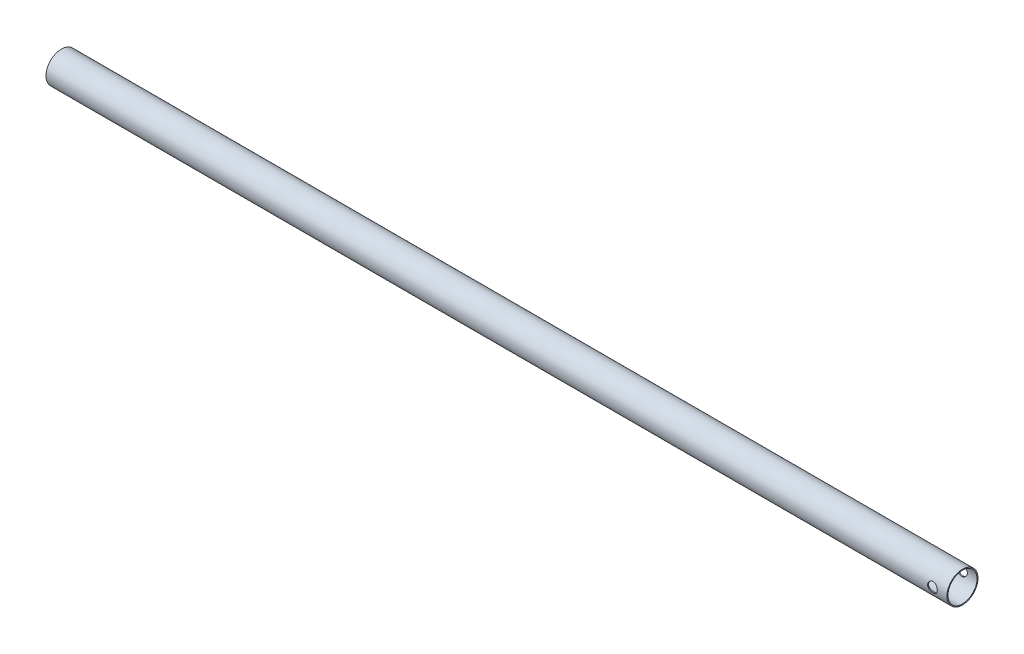
ISO-10303-21;
HEADER;
FILE_DESCRIPTION(('STEP AP214'),'2;1');
FILE_NAME('part.step','',(''),(''),'','','');
FILE_SCHEMA(('AUTOMOTIVE_DESIGN { 1 0 10303 214 1 1 1 1 }'));
ENDSEC;
DATA;
#1=APPLICATION_CONTEXT('core data for automotive mechanical design processes');
#2=APPLICATION_PROTOCOL_DEFINITION('international standard','automotive_design',2000,#1);
#3=PRODUCT_CONTEXT('',#1,'mechanical');
#4=PRODUCT('Part','Part','',(#3));
#5=PRODUCT_RELATED_PRODUCT_CATEGORY('part','',(#4));
#6=PRODUCT_DEFINITION_FORMATION('','',#4);
#7=PRODUCT_DEFINITION_CONTEXT('part definition',#1,'design');
#8=PRODUCT_DEFINITION('design','',#6,#7);
#9=PRODUCT_DEFINITION_SHAPE('','',#8);
#10=(LENGTH_UNIT() NAMED_UNIT(*) SI_UNIT(.MILLI.,.METRE.));
#11=(NAMED_UNIT(*) PLANE_ANGLE_UNIT() SI_UNIT($,.RADIAN.));
#12=(NAMED_UNIT(*) SI_UNIT($,.STERADIAN.) SOLID_ANGLE_UNIT());
#13=UNCERTAINTY_MEASURE_WITH_UNIT(LENGTH_MEASURE(1.E-05),#10,'distance_accuracy_value','');
#14=(GEOMETRIC_REPRESENTATION_CONTEXT(3) GLOBAL_UNCERTAINTY_ASSIGNED_CONTEXT((#13)) GLOBAL_UNIT_ASSIGNED_CONTEXT((#10,
#11,#12)) REPRESENTATION_CONTEXT('',''));
#15=CARTESIAN_POINT('',(0.,0.,0.));
#16=DIRECTION('',(0.,0.,1.));
#17=DIRECTION('',(1.,0.,0.));
#18=AXIS2_PLACEMENT_3D('',#15,#16,#17);
#19=CARTESIAN_POINT('',(-929.,0.,0.));
#20=DIRECTION('',(1.,0.,0.));
#21=DIRECTION('',(0.,0.,-1.));
#22=AXIS2_PLACEMENT_3D('',#19,#20,#21);
#23=CYLINDRICAL_SURFACE('',#22,16.);
#24=CARTESIAN_POINT('',(-20.,0.,-16.));
#25=CARTESIAN_POINT('',(-19.9999982136497,0.273756740698178,-15.9999986351195));
#26=CARTESIAN_POINT('',(-19.9774430922222,0.547532210011409,-15.9929077993933));
#27=CARTESIAN_POINT('',(-19.888055033843,1.08707683835382,-15.9653157635526));
#28=CARTESIAN_POINT('',(-19.8212120745424,1.35284417090373,-15.9448115279957));
#29=CARTESIAN_POINT('',(-19.6457225152172,1.86851417460313,-15.892632627915));
#30=CARTESIAN_POINT('',(-19.5371406213887,2.11844070794284,-15.860975259956));
#31=CARTESIAN_POINT('',(-19.2815307292862,2.59653920938622,-15.7897587664487));
#32=CARTESIAN_POINT('',(-19.1344966728757,2.82470774178094,-15.7501983960149));
#33=CARTESIAN_POINT('',(-18.8013760319326,3.25986133980768,-15.6660085495921));
#34=CARTESIAN_POINT('',(-18.6143164597633,3.46608011262119,-15.621268637007));
#35=CARTESIAN_POINT('',(-18.2085264303382,3.84478952815342,-15.5324018550409));
#36=CARTESIAN_POINT('',(-17.9897900899934,4.01727389161514,-15.4882751012093));
#37=CARTESIAN_POINT('',(-17.5202217447927,4.32777345930637,-15.4044457876484));
#38=CARTESIAN_POINT('',(-17.2687300899923,4.4648313659311,-15.3648795310221));
#39=CARTESIAN_POINT('',(-16.7448307401774,4.69438964299238,-15.2963120709366));
#40=CARTESIAN_POINT('',(-16.4724285768566,4.78690175085853,-15.2673080849026));
#41=CARTESIAN_POINT('',(-15.9230876901663,4.92193839721856,-15.224304279618));
#42=CARTESIAN_POINT('',(-15.6465326254318,4.96588440031618,-15.2098789171452));
#43=CARTESIAN_POINT('',(-15.0896275243652,5.00698220147793,-15.1964022056731));
#44=CARTESIAN_POINT('',(-14.809278516739,5.00414643984172,-15.1973467694717));
#45=CARTESIAN_POINT('',(-14.2645021588889,4.95287298929817,-15.2141275626545));
#46=CARTESIAN_POINT('',(-13.9998834964481,4.90624231472934,-15.2293736684469));
#47=CARTESIAN_POINT('',(-13.482431373751,4.7716325341796,-15.272081024701));
#48=CARTESIAN_POINT('',(-13.2295991691417,4.68364903377187,-15.2995435733467));
#49=CARTESIAN_POINT('',(-12.7385922223016,4.46755498726522,-15.3640417609541));
#50=CARTESIAN_POINT('',(-12.5006855572407,4.33887702648706,-15.4012113865356));
#51=CARTESIAN_POINT('',(-12.0492489284749,4.04544082951013,-15.4808742631002));
#52=CARTESIAN_POINT('',(-11.8357253189828,3.88067322086205,-15.523368895754));
#53=CARTESIAN_POINT('',(-11.4289002263345,3.51086781672958,-15.6112611120491));
#54=CARTESIAN_POINT('',(-11.2369617688819,3.30433828237156,-15.6567027842357));
#55=CARTESIAN_POINT('',(-10.8901124256806,2.86145763238183,-15.7436628303753));
#56=CARTESIAN_POINT('',(-10.735204283123,2.625104309396,-15.7851809135328));
#57=CARTESIAN_POINT('',(-10.4658892455951,2.12665844186189,-15.8600517956098));
#58=CARTESIAN_POINT('',(-10.3518074581442,1.86437962767713,-15.8933384259289));
#59=CARTESIAN_POINT('',(-10.1697879965937,1.32307191113055,-15.9475182331416));
#60=CARTESIAN_POINT('',(-10.1018363110464,1.04404812289842,-15.9684151730059));
#61=CARTESIAN_POINT('',(-10.0163278296841,0.488740629161379,-15.9948555758007));
#62=CARTESIAN_POINT('',(-9.9969258256259,0.212767395155368,-16.0009609158175));
#63=CARTESIAN_POINT('',(-10.0038649065493,-0.338521222930351,-15.9987919892393));
#64=CARTESIAN_POINT('',(-10.0301993092904,-0.613836697226041,-15.9905198232454));
#65=CARTESIAN_POINT('',(-10.1263823704255,-1.1488773319034,-15.9608945507905));
#66=CARTESIAN_POINT('',(-10.1951330704499,-1.40881991368375,-15.9398717244275));
#67=CARTESIAN_POINT('',(-10.3728574094669,-1.91340771544551,-15.8872048551716));
#68=CARTESIAN_POINT('',(-10.4818360161,-2.15805104179624,-15.8555595005737));
#69=CARTESIAN_POINT('',(-10.7398928661947,-2.63172962668876,-15.783941710377));
#70=CARTESIAN_POINT('',(-10.8898839499872,-2.86023895915117,-15.7437850727067));
#71=CARTESIAN_POINT('',(-11.2246128404697,-3.28946340384104,-15.6597364001372));
#72=CARTESIAN_POINT('',(-11.4093600709786,-3.4901709521758,-15.6158433539155));
#73=CARTESIAN_POINT('',(-11.8170355602084,-3.86634985167608,-15.5270797953257));
#74=CARTESIAN_POINT('',(-12.0411866549569,-4.04050609358125,-15.4822394682577));
#75=CARTESIAN_POINT('',(-12.5165064655071,-4.34885000980606,-15.3984778838242));
#76=CARTESIAN_POINT('',(-12.7676747521079,-4.48303831893719,-15.3595565324524));
#77=CARTESIAN_POINT('',(-13.2893806914819,-4.70680333922169,-15.2924712932348));
#78=CARTESIAN_POINT('',(-13.5598385977429,-4.7965527822405,-15.264265854275));
#79=CARTESIAN_POINT('',(-14.1130899729945,-4.92891577272361,-15.2220468337724));
#80=CARTESIAN_POINT('',(-14.3958787053741,-4.97154725655978,-15.2080278520491));
#81=CARTESIAN_POINT('',(-14.9520163503217,-5.00717624632503,-15.1963317085551));
#82=CARTESIAN_POINT('',(-15.2252138153897,-5.00233118486543,-15.1979441840057));
#83=CARTESIAN_POINT('',(-15.7666983397678,-4.94835272515335,-15.2156036150361));
#84=CARTESIAN_POINT('',(-16.0349856275469,-4.89922139290049,-15.2316498972642));
#85=CARTESIAN_POINT('',(-16.5551761583676,-4.7595091965447,-15.2758725673356));
#86=CARTESIAN_POINT('',(-16.8072617643734,-4.66954569624033,-15.3038679276103));
#87=CARTESIAN_POINT('',(-17.292961654136,-4.45120909339998,-15.3687881701826));
#88=CARTESIAN_POINT('',(-17.5265721683136,-4.32282817776947,-15.4057148685869));
#89=CARTESIAN_POINT('',(-17.9785838817593,-4.02542700053973,-15.4861394813401));
#90=CARTESIAN_POINT('',(-18.196032518001,-3.85501334096529,-15.5298379569183));
#91=CARTESIAN_POINT('',(-18.599945312448,-3.48083598561919,-15.6179599528484));
#92=CARTESIAN_POINT('',(-18.7864011559642,-3.27706336937756,-15.6623836642662));
#93=CARTESIAN_POINT('',(-19.1291301534517,-2.83394665129338,-15.7486908780989));
#94=CARTESIAN_POINT('',(-19.2842189457998,-2.59365829794954,-15.7904440692269));
#95=CARTESIAN_POINT('',(-19.5515956605578,-2.0891165520546,-15.8650707718751));
#96=CARTESIAN_POINT('',(-19.6639004085673,-1.82487263118179,-15.8979477726329));
#97=CARTESIAN_POINT('',(-19.8343654704339,-1.30299054149591,-15.9488260293388));
#98=CARTESIAN_POINT('',(-19.8962994692213,-1.04668134845019,-15.9678496322456));
#99=CARTESIAN_POINT('',(-19.9791134398709,-0.526919581760988,-15.9934360136194));
#100=CARTESIAN_POINT('',(-20.000001719216,-0.263468464558692,-16.0000013135858));
#101=CARTESIAN_POINT('',(-20.,0.,-16.));
#102=B_SPLINE_CURVE_WITH_KNOTS('',3,(#24,#25,#26,#27,#28,#29,#30,#31,#32,#33,#34,#35,#36,#37,
#38,#39,#40,#41,#42,#43,#44,#45,#46,#47,#48,#49,#50,#51,#52,#53,#54,#55,#56,#57,#58,#59,#60,#61,
#62,#63,#64,#65,#66,#67,#68,#69,#70,#71,#72,#73,#74,#75,#76,#77,#78,#79,#80,#81,#82,#83,#84,#85,
#86,#87,#88,#89,#90,#91,#92,#93,#94,#95,#96,#97,#98,#99,#100,#101),.UNSPECIFIED.,.T.,.F.,(4,2,2,
2,2,2,2,2,2,2,2,2,2,2,2,2,2,2,2,2,2,2,2,2,2,2,2,2,2,2,2,2,2,2,2,2,2,2,4),(0.,0.820301797730039,
1.64078929339627,2.46000991680975,3.27935968623357,4.12151288780634,4.96382269725105,
5.82695084991453,6.68985145121464,7.52676600672195,8.36345801183909,9.16707669695194,
9.97078079925601,10.7862257089153,11.6018826405078,12.4546698912775,13.3075202966256,
14.1670184276843,15.0262553798757,15.852302742023,16.678229426068,17.4836250690084,
18.2891202014735,19.1142529896272,19.9396098284639,20.7976711486191,21.655718839442,
22.5104046302277,23.3647649559871,24.1804881394266,24.9961732705188,25.7999165363423,
26.6038233736824,27.4391805607299,28.274761495409,29.1376267255319,30.0001522671289,
30.789785466537,31.5792588309973),.UNSPECIFIED.);
#103=CARTESIAN_POINT('',(-20.,0.,-16.));
#104=VERTEX_POINT('',#103);
#105=EDGE_CURVE('E84',#104,#104,#102,.T.);
#106=ORIENTED_EDGE('',*,*,#105,.F.);
#107=EDGE_LOOP('',(#106));
#108=FACE_BOUND('',#107,.T.);
#109=CARTESIAN_POINT('',(-10.,0.,16.));
#110=CARTESIAN_POINT('',(-10.0000017863503,0.273756740698177,15.9999986351195));
#111=CARTESIAN_POINT('',(-10.0225569077778,0.547532210011408,15.9929077993933));
#112=CARTESIAN_POINT('',(-10.111944966157,1.08707683835382,15.9653157635526));
#113=CARTESIAN_POINT('',(-10.1787879254576,1.35284417090373,15.9448115279957));
#114=CARTESIAN_POINT('',(-10.3542774847828,1.86851417460312,15.892632627915));
#115=CARTESIAN_POINT('',(-10.4628593786113,2.11844070794284,15.860975259956));
#116=CARTESIAN_POINT('',(-10.7184692707138,2.59653920938621,15.7897587664487));
#117=CARTESIAN_POINT('',(-10.8655033271243,2.82470774178094,15.7501983960149));
#118=CARTESIAN_POINT('',(-11.1986239680674,3.25986133980768,15.6660085495921));
#119=CARTESIAN_POINT('',(-11.3856835402367,3.46608011262119,15.621268637007));
#120=CARTESIAN_POINT('',(-11.7914735696618,3.84478952815342,15.5324018550409));
#121=CARTESIAN_POINT('',(-12.0102099100066,4.01727389161514,15.4882751012093));
#122=CARTESIAN_POINT('',(-12.4797782552073,4.32777345930637,15.4044457876484));
#123=CARTESIAN_POINT('',(-12.7312699100077,4.4648313659311,15.3648795310221));
#124=CARTESIAN_POINT('',(-13.2551692598226,4.69438964299238,15.2963120709366));
#125=CARTESIAN_POINT('',(-13.5275714231434,4.78690175085853,15.2673080849026));
#126=CARTESIAN_POINT('',(-14.0769123098337,4.92193839721856,15.224304279618));
#127=CARTESIAN_POINT('',(-14.3534673745682,4.96588440031618,15.2098789171452));
#128=CARTESIAN_POINT('',(-14.9103724756348,5.00698220147793,15.1964022056731));
#129=CARTESIAN_POINT('',(-15.190721483261,5.00414643984172,15.1973467694717));
#130=CARTESIAN_POINT('',(-15.7354978411111,4.95287298929817,15.2141275626545));
#131=CARTESIAN_POINT('',(-16.0001165035519,4.90624231472934,15.2293736684469));
#132=CARTESIAN_POINT('',(-16.517568626249,4.77163253417961,15.272081024701));
#133=CARTESIAN_POINT('',(-16.7704008308583,4.68364903377187,15.2995435733467));
#134=CARTESIAN_POINT('',(-17.2614077776984,4.46755498726522,15.3640417609541));
#135=CARTESIAN_POINT('',(-17.4993144427593,4.33887702648706,15.4012113865356));
#136=CARTESIAN_POINT('',(-17.9507510715251,4.04544082951013,15.4808742631002));
#137=CARTESIAN_POINT('',(-18.1642746810172,3.88067322086205,15.523368895754));
#138=CARTESIAN_POINT('',(-18.5710997736655,3.51086781672958,15.6112611120491));
#139=CARTESIAN_POINT('',(-18.7630382311181,3.30433828237156,15.6567027842357));
#140=CARTESIAN_POINT('',(-19.1098875743194,2.86145763238183,15.7436628303753));
#141=CARTESIAN_POINT('',(-19.264795716877,2.625104309396,15.7851809135328));
#142=CARTESIAN_POINT('',(-19.5341107544049,2.12665844186189,15.8600517956098));
#143=CARTESIAN_POINT('',(-19.6481925418558,1.86437962767714,15.8933384259289));
#144=CARTESIAN_POINT('',(-19.8302120034063,1.32307191113055,15.9475182331416));
#145=CARTESIAN_POINT('',(-19.8981636889536,1.04404812289843,15.9684151730059));
#146=CARTESIAN_POINT('',(-19.9836721703159,0.488740629161383,15.9948555758007));
#147=CARTESIAN_POINT('',(-20.0030741743741,0.212767395155371,16.0009609158175));
#148=CARTESIAN_POINT('',(-19.9961350934507,-0.338521222930347,15.9987919892393));
#149=CARTESIAN_POINT('',(-19.9698006907096,-0.613836697226038,15.9905198232454));
#150=CARTESIAN_POINT('',(-19.8736176295745,-1.1488773319034,15.9608945507905));
#151=CARTESIAN_POINT('',(-19.8048669295501,-1.40881991368375,15.9398717244275));
#152=CARTESIAN_POINT('',(-19.6271425905331,-1.91340771544551,15.8872048551716));
#153=CARTESIAN_POINT('',(-19.5181639839,-2.15805104179623,15.8555595005737));
#154=CARTESIAN_POINT('',(-19.2601071338053,-2.63172962668875,15.783941710377));
#155=CARTESIAN_POINT('',(-19.1101160500128,-2.86023895915116,15.7437850727067));
#156=CARTESIAN_POINT('',(-18.7753871595303,-3.28946340384104,15.6597364001372));
#157=CARTESIAN_POINT('',(-18.5906399290214,-3.4901709521758,15.6158433539155));
#158=CARTESIAN_POINT('',(-18.1829644397916,-3.86634985167608,15.5270797953257));
#159=CARTESIAN_POINT('',(-17.9588133450431,-4.04050609358125,15.4822394682577));
#160=CARTESIAN_POINT('',(-17.4834935344929,-4.34885000980606,15.3984778838242));
#161=CARTESIAN_POINT('',(-17.2323252478921,-4.48303831893719,15.3595565324524));
#162=CARTESIAN_POINT('',(-16.7106193085181,-4.70680333922169,15.2924712932348));
#163=CARTESIAN_POINT('',(-16.4401614022571,-4.7965527822405,15.264265854275));
#164=CARTESIAN_POINT('',(-15.8869100270055,-4.92891577272361,15.2220468337724));
#165=CARTESIAN_POINT('',(-15.6041212946259,-4.97154725655978,15.2080278520491));
#166=CARTESIAN_POINT('',(-15.0479836496783,-5.00717624632503,15.1963317085551));
#167=CARTESIAN_POINT('',(-14.7747861846103,-5.00233118486543,15.1979441840057));
#168=CARTESIAN_POINT('',(-14.2333016602322,-4.94835272515335,15.2156036150361));
#169=CARTESIAN_POINT('',(-13.9650143724531,-4.89922139290049,15.2316498972642));
#170=CARTESIAN_POINT('',(-13.4448238416324,-4.7595091965447,15.2758725673356));
#171=CARTESIAN_POINT('',(-13.1927382356266,-4.66954569624033,15.3038679276103));
#172=CARTESIAN_POINT('',(-12.707038345864,-4.45120909339998,15.3687881701826));
#173=CARTESIAN_POINT('',(-12.4734278316864,-4.32282817776948,15.4057148685869));
#174=CARTESIAN_POINT('',(-12.0214161182407,-4.02542700053973,15.4861394813401));
#175=CARTESIAN_POINT('',(-11.803967481999,-3.85501334096529,15.5298379569183));
#176=CARTESIAN_POINT('',(-11.400054687552,-3.4808359856192,15.6179599528484));
#177=CARTESIAN_POINT('',(-11.2135988440358,-3.27706336937756,15.6623836642662));
#178=CARTESIAN_POINT('',(-10.8708698465483,-2.83394665129339,15.7486908780989));
#179=CARTESIAN_POINT('',(-10.7157810542002,-2.59365829794954,15.7904440692269));
#180=CARTESIAN_POINT('',(-10.4484043394422,-2.0891165520546,15.8650707718751));
#181=CARTESIAN_POINT('',(-10.3360995914327,-1.8248726311818,15.8979477726329));
#182=CARTESIAN_POINT('',(-10.1656345295661,-1.30299054149592,15.9488260293388));
#183=CARTESIAN_POINT('',(-10.1037005307786,-1.04668134845019,15.9678496322456));
#184=CARTESIAN_POINT('',(-10.0208865601291,-0.526919581760991,15.9934360136194));
#185=CARTESIAN_POINT('',(-9.999998280784,-0.263468464558694,16.0000013135858));
#186=CARTESIAN_POINT('',(-10.,0.,16.));
#187=B_SPLINE_CURVE_WITH_KNOTS('',3,(#109,#110,#111,#112,#113,#114,#115,#116,#117,#118,#119,
#120,#121,#122,#123,#124,#125,#126,#127,#128,#129,#130,#131,#132,#133,#134,#135,#136,#137,#138,
#139,#140,#141,#142,#143,#144,#145,#146,#147,#148,#149,#150,#151,#152,#153,#154,#155,#156,#157,
#158,#159,#160,#161,#162,#163,#164,#165,#166,#167,#168,#169,#170,#171,#172,#173,#174,#175,#176,
#177,#178,#179,#180,#181,#182,#183,#184,#185,#186),.UNSPECIFIED.,.T.,.F.,(4,2,2,2,2,2,2,2,2,2,2,
2,2,2,2,2,2,2,2,2,2,2,2,2,2,2,2,2,2,2,2,2,2,2,2,2,2,2,4),(0.,0.82030179773004,1.64078929339627,
2.46000991680975,3.27935968623356,4.12151288780633,4.96382269725105,5.82695084991453,
6.68985145121464,7.52676600672195,8.36345801183909,9.16707669695194,9.97078079925601,
10.7862257089153,11.6018826405078,12.4546698912775,13.3075202966256,14.1670184276843,
15.0262553798757,15.852302742023,16.678229426068,17.4836250690084,18.2891202014735,
19.1142529896272,19.9396098284639,20.7976711486191,21.655718839442,22.5104046302277,
23.3647649559871,24.1804881394266,24.9961732705188,25.7999165363422,26.6038233736824,
27.4391805607299,28.274761495409,29.1376267255319,30.0001522671289,30.789785466537,
31.5792588309973),.UNSPECIFIED.);
#188=CARTESIAN_POINT('',(-10.,0.,16.));
#189=VERTEX_POINT('',#188);
#190=EDGE_CURVE('E80',#189,#189,#187,.T.);
#191=ORIENTED_EDGE('',*,*,#190,.F.);
#192=EDGE_LOOP('',(#191));
#193=FACE_BOUND('',#192,.T.);
#194=CARTESIAN_POINT('',(-929.,0.,0.));
#195=DIRECTION('',(1.,0.,0.));
#196=DIRECTION('',(0.,0.,-1.));
#197=AXIS2_PLACEMENT_3D('',#194,#195,#196);
#198=CIRCLE('',#197,16.);
#199=CARTESIAN_POINT('',(-929.,0.,-16.));
#200=VERTEX_POINT('',#199);
#201=EDGE_CURVE('E11',#200,#200,#198,.T.);
#202=ORIENTED_EDGE('',*,*,#201,.T.);
#203=EDGE_LOOP('',(#202));
#204=FACE_BOUND('',#203,.T.);
#205=CARTESIAN_POINT('',(0.,0.,0.));
#206=DIRECTION('',(1.,0.,0.));
#207=DIRECTION('',(0.,0.,-1.));
#208=AXIS2_PLACEMENT_3D('',#205,#206,#207);
#209=CIRCLE('',#208,16.);
#210=CARTESIAN_POINT('',(0.,0.,-16.));
#211=VERTEX_POINT('',#210);
#212=EDGE_CURVE('E53',#211,#211,#209,.T.);
#213=ORIENTED_EDGE('',*,*,#212,.F.);
#214=EDGE_LOOP('',(#213));
#215=FACE_BOUND('',#214,.T.);
#216=ADVANCED_FACE('F41',(#108,#193,#204,#215),#23,.T.);
#217=CARTESIAN_POINT('',(-929.,0.,0.));
#218=DIRECTION('',(1.,0.,0.));
#219=DIRECTION('',(0.,0.,-1.));
#220=AXIS2_PLACEMENT_3D('',#217,#218,#219);
#221=PLANE('',#220);
#222=CARTESIAN_POINT('',(-929.,0.,0.));
#223=DIRECTION('',(1.,0.,0.));
#224=DIRECTION('',(0.,0.,-1.));
#225=AXIS2_PLACEMENT_3D('',#222,#223,#224);
#226=CIRCLE('',#225,15.);
#227=CARTESIAN_POINT('',(-929.,0.,-15.));
#228=VERTEX_POINT('',#227);
#229=EDGE_CURVE('E58',#228,#228,#226,.T.);
#230=ORIENTED_EDGE('',*,*,#229,.T.);
#231=EDGE_LOOP('',(#230));
#232=FACE_BOUND('',#231,.T.);
#233=ORIENTED_EDGE('',*,*,#201,.F.);
#234=EDGE_LOOP('',(#233));
#235=FACE_BOUND('',#234,.T.);
#236=ADVANCED_FACE('F98',(#232,#235),#221,.F.);
#237=CARTESIAN_POINT('',(0.,0.,0.));
#238=DIRECTION('',(1.,0.,0.));
#239=DIRECTION('',(0.,0.,-1.));
#240=AXIS2_PLACEMENT_3D('',#237,#238,#239);
#241=PLANE('',#240);
#242=CARTESIAN_POINT('',(0.,0.,0.));
#243=DIRECTION('',(1.,0.,0.));
#244=DIRECTION('',(0.,0.,-1.));
#245=AXIS2_PLACEMENT_3D('',#242,#243,#244);
#246=CIRCLE('',#245,15.);
#247=CARTESIAN_POINT('',(0.,0.,-15.));
#248=VERTEX_POINT('',#247);
#249=EDGE_CURVE('E61',#248,#248,#246,.T.);
#250=ORIENTED_EDGE('',*,*,#249,.F.);
#251=EDGE_LOOP('',(#250));
#252=FACE_BOUND('',#251,.T.);
#253=ORIENTED_EDGE('',*,*,#212,.T.);
#254=EDGE_LOOP('',(#253));
#255=FACE_BOUND('',#254,.T.);
#256=ADVANCED_FACE('F95',(#252,#255),#241,.T.);
#257=CARTESIAN_POINT('',(-929.,0.,0.));
#258=DIRECTION('',(1.,0.,0.));
#259=DIRECTION('',(0.,0.,-1.));
#260=AXIS2_PLACEMENT_3D('',#257,#258,#259);
#261=CYLINDRICAL_SURFACE('',#260,15.);
#262=CARTESIAN_POINT('',(-20.,0.,-15.));
#263=CARTESIAN_POINT('',(-20.0000012686582,0.272816814433608,-15.0000007650471));
#264=CARTESIAN_POINT('',(-19.977598669364,0.545625972692718,-14.9924884753769));
#265=CARTESIAN_POINT('',(-19.8888544559139,1.08320880436489,-14.9632605101644));
#266=CARTESIAN_POINT('',(-19.8225082802552,1.3479816405942,-14.941543360109));
#267=CARTESIAN_POINT('',(-19.6484037830799,1.86166394750877,-14.8862653953208));
#268=CARTESIAN_POINT('',(-19.5407146877042,2.11059912942976,-14.8527243865377));
#269=CARTESIAN_POINT('',(-19.2872941358077,2.58687468402704,-14.7772222858721));
#270=CARTESIAN_POINT('',(-19.1415551749849,2.81421078479507,-14.7352595334076));
#271=CARTESIAN_POINT('',(-18.8108709757084,3.24870837510974,-14.6457047221309));
#272=CARTESIAN_POINT('',(-18.6248438287057,3.45501850148552,-14.5979778231161));
#273=CARTESIAN_POINT('',(-18.221164226459,3.83416346351645,-14.5030157392292));
#274=CARTESIAN_POINT('',(-18.0035048253269,4.00699092746984,-14.4557806648007));
#275=CARTESIAN_POINT('',(-17.5350744240448,4.31912471111899,-14.3656666235818));
#276=CARTESIAN_POINT('',(-17.2835313014492,4.45732429102251,-14.3229519627198));
#277=CARTESIAN_POINT('',(-16.7591195278211,4.68909436930558,-14.2487652698844));
#278=CARTESIAN_POINT('',(-16.4862574142214,4.78267848691248,-14.2172898077928));
#279=CARTESIAN_POINT('',(-15.9366338924888,4.91936730756488,-14.1705651637056));
#280=CARTESIAN_POINT('',(-15.6603139575402,4.96406724136036,-14.1548047884338));
#281=CARTESIAN_POINT('',(-15.103681229235,5.00670561667087,-14.1397828315221));
#282=CARTESIAN_POINT('',(-14.8233696964841,5.00465850803658,-14.1405161515599));
#283=CARTESIAN_POINT('',(-14.2803168477388,4.95509951850356,-14.1579507500054));
#284=CARTESIAN_POINT('',(-14.0173579852814,4.90966956578088,-14.1739207918415));
#285=CARTESIAN_POINT('',(-13.5030329018494,4.77803081419367,-14.2188328846856));
#286=CARTESIAN_POINT('',(-13.2516680727977,4.69181713294739,-14.2477764887883));
#287=CARTESIAN_POINT('',(-12.7629362520803,4.47969529031768,-14.3158955569848));
#288=CARTESIAN_POINT('',(-12.5258598726625,4.35317024354077,-14.3552282897692));
#289=CARTESIAN_POINT('',(-12.0756454585912,4.06444553151123,-14.4396279286729));
#290=CARTESIAN_POINT('',(-11.8625143653303,3.9022355618188,-14.4846964894921));
#291=CARTESIAN_POINT('',(-11.4545420091991,3.53674666341247,-14.5783664584198));
#292=CARTESIAN_POINT('',(-11.2612365274554,3.3317657503819,-14.6270294677509));
#293=CARTESIAN_POINT('',(-10.9113436666822,2.89169784984997,-14.7203469193431));
#294=CARTESIAN_POINT('',(-10.7547598091773,2.65660797830397,-14.765000976901));
#295=CARTESIAN_POINT('',(-10.4815184988249,2.15973806523143,-14.8458553968921));
#296=CARTESIAN_POINT('',(-10.3652725432964,1.8977163820817,-14.8819675004026));
#297=CARTESIAN_POINT('',(-10.1789841302214,1.35634541682251,-14.9410283572211));
#298=CARTESIAN_POINT('',(-10.1089256228828,1.07700219077475,-14.9639816827438));
#299=CARTESIAN_POINT('',(-10.0197216698882,0.521919147646519,-14.9933813535722));
#300=CARTESIAN_POINT('',(-9.99850095413625,0.246547999324225,-15.0005000916864));
#301=CARTESIAN_POINT('',(-10.0016633679923,-0.303875349801196,-14.9994451347413));
#302=CARTESIAN_POINT('',(-10.0260387998994,-0.57892759659826,-14.9912740209681));
#303=CARTESIAN_POINT('',(-10.1180595386798,-1.11259933152128,-14.9610012358552));
#304=CARTESIAN_POINT('',(-10.1844310302475,-1.37146403417422,-14.9393099355596));
#305=CARTESIAN_POINT('',(-10.3569672223336,-1.87427979289787,-14.8845923415035));
#306=CARTESIAN_POINT('',(-10.4631369973389,-2.11822894254304,-14.8515646023338));
#307=CARTESIAN_POINT('',(-10.7153521592039,-2.59144148196637,-14.7764465643645));
#308=CARTESIAN_POINT('',(-10.8623729664159,-2.82014979608574,-14.7341407377893));
#309=CARTESIAN_POINT('',(-11.1909707500674,-3.25032415067794,-14.6452626958131));
#310=CARTESIAN_POINT('',(-11.3725582801588,-3.45178183897789,-14.5986891796914));
#311=CARTESIAN_POINT('',(-11.7748937550329,-3.8312625390315,-14.5038423990222));
#312=CARTESIAN_POINT('',(-11.9970461346343,-4.00780484622886,-14.4555880543714));
#313=CARTESIAN_POINT('',(-12.4688578390544,-4.32128761161788,-14.3649986647354));
#314=CARTESIAN_POINT('',(-12.7185173931704,-4.45822773965507,-14.3226636691001));
#315=CARTESIAN_POINT('',(-13.2383650764495,-4.68798465208181,-14.2491195895692));
#316=CARTESIAN_POINT('',(-13.5085103958438,-4.78089066082511,-14.2178880396489));
#317=CARTESIAN_POINT('',(-14.0618932502207,-4.91947333379678,-14.1705416153225));
#318=CARTESIAN_POINT('',(-14.3451248270218,-4.9651712747697,-14.154419931182));
#319=CARTESIAN_POINT('',(-14.9009854802046,-5.00638141238671,-14.1398929437089));
#320=CARTESIAN_POINT('',(-15.1734117014341,-5.004351286542,-14.1406200128708));
#321=CARTESIAN_POINT('',(-15.7138253746103,-4.95621146724347,-14.1575634911934));
#322=CARTESIAN_POINT('',(-15.9818130897754,-4.91010439729293,-14.1737789784681));
#323=CARTESIAN_POINT('',(-16.5006783150124,-4.77685906564673,-14.2192262152446));
#324=CARTESIAN_POINT('',(-16.7517841250225,-4.69051673007757,-14.2482049011239));
#325=CARTESIAN_POINT('',(-17.2361370346913,-4.47989682879873,-14.3158199409234));
#326=CARTESIAN_POINT('',(-17.46938015594,-4.35561084276903,-14.3544584381697));
#327=CARTESIAN_POINT('',(-17.9224183496146,-4.06630346291715,-14.4391414613023));
#328=CARTESIAN_POINT('',(-18.1411825094919,-3.8997412138229,-14.4854355821069));
#329=CARTESIAN_POINT('',(-18.548449066921,-3.53321441567824,-14.5791678141626));
#330=CARTESIAN_POINT('',(-18.7369428784404,-3.33324042225741,-14.6266062456186));
#331=CARTESIAN_POINT('',(-19.0857220614459,-2.89620778460344,-14.7195015262772));
#332=CARTESIAN_POINT('',(-19.244621738755,-2.65800756749864,-14.7648090900628));
#333=CARTESIAN_POINT('',(-19.5199521442532,-2.15678678703312,-14.8462995586306));
#334=CARTESIAN_POINT('',(-19.6363937296102,-1.89377259066174,-14.8824847953965));
#335=CARTESIAN_POINT('',(-19.8186081624434,-1.36246823600488,-14.9402757534271));
#336=CARTESIAN_POINT('',(-19.8864123313169,-1.09493878838204,-14.9624606211261));
#337=CARTESIAN_POINT('',(-19.9771014033856,-0.551602080051231,-14.9923203532111));
#338=CARTESIAN_POINT('',(-19.9999987174827,-0.275797127843723,-14.9999992265953));
#339=CARTESIAN_POINT('',(-20.,0.,-15.));
#340=B_SPLINE_CURVE_WITH_KNOTS('',3,(#262,#263,#264,#265,#266,#267,#268,#269,#270,#271,#272,
#273,#274,#275,#276,#277,#278,#279,#280,#281,#282,#283,#284,#285,#286,#287,#288,#289,#290,#291,
#292,#293,#294,#295,#296,#297,#298,#299,#300,#301,#302,#303,#304,#305,#306,#307,#308,#309,#310,
#311,#312,#313,#314,#315,#316,#317,#318,#319,#320,#321,#322,#323,#324,#325,#326,#327,#328,#329,
#330,#331,#332,#333,#334,#335,#336,#337,#338,#339),.UNSPECIFIED.,.T.,.F.,(4,2,2,2,2,2,2,2,2,2,2,
2,2,2,2,2,2,2,2,2,2,2,2,2,2,2,2,2,2,2,2,2,2,2,2,2,2,2,4),(0.,0.817435530130055,1.63495592633761,
2.45111336435137,3.2674318889955,4.1092342141378,4.95122166437652,5.81741924118921,
6.6833522346775,7.52009628712784,8.35658169941011,9.15484132763713,9.95319654288061,
10.764408557863,11.5758551280169,12.4296652906749,13.2835572984374,14.1459202826244,
15.0079834439669,15.832679158865,16.6572356583153,17.4579078990172,18.2586822643117,
19.0805199922933,19.9026090412011,20.7620511441441,21.6215004118563,22.479200691445,
23.3365142353985,24.1497833033194,24.9630039676753,25.7607793541274,26.5587319089054,
27.3915033346967,28.2245105562955,29.0899830418615,29.9552340577293,30.7818279187972,
31.6081933020135),.UNSPECIFIED.);
#341=CARTESIAN_POINT('',(-20.,0.,-15.));
#342=VERTEX_POINT('',#341);
#343=EDGE_CURVE('E45',#342,#342,#340,.T.);
#344=ORIENTED_EDGE('',*,*,#343,.T.);
#345=EDGE_LOOP('',(#344));
#346=FACE_BOUND('',#345,.T.);
#347=CARTESIAN_POINT('',(-10.,0.,15.));
#348=CARTESIAN_POINT('',(-9.99999873134179,0.272816814433607,15.0000007650471));
#349=CARTESIAN_POINT('',(-10.022401330636,0.545625972692718,14.9924884753769));
#350=CARTESIAN_POINT('',(-10.1111455440861,1.08320880436489,14.9632605101644));
#351=CARTESIAN_POINT('',(-10.1774917197448,1.3479816405942,14.941543360109));
#352=CARTESIAN_POINT('',(-10.3515962169201,1.86166394750877,14.8862653953208));
#353=CARTESIAN_POINT('',(-10.4592853122958,2.11059912942976,14.8527243865377));
#354=CARTESIAN_POINT('',(-10.7127058641923,2.58687468402704,14.7772222858721));
#355=CARTESIAN_POINT('',(-10.8584448250151,2.81421078479507,14.7352595334076));
#356=CARTESIAN_POINT('',(-11.1891290242916,3.24870837510974,14.6457047221309));
#357=CARTESIAN_POINT('',(-11.3751561712943,3.45501850148552,14.5979778231161));
#358=CARTESIAN_POINT('',(-11.778835773541,3.83416346351645,14.5030157392292));
#359=CARTESIAN_POINT('',(-11.9964951746731,4.00699092746984,14.4557806648007));
#360=CARTESIAN_POINT('',(-12.4649255759551,4.31912471111898,14.3656666235818));
#361=CARTESIAN_POINT('',(-12.7164686985508,4.45732429102251,14.3229519627198));
#362=CARTESIAN_POINT('',(-13.2408804721789,4.68909436930558,14.2487652698844));
#363=CARTESIAN_POINT('',(-13.5137425857786,4.78267848691247,14.2172898077928));
#364=CARTESIAN_POINT('',(-14.0633661075112,4.91936730756488,14.1705651637056));
#365=CARTESIAN_POINT('',(-14.3396860424598,4.96406724136036,14.1548047884338));
#366=CARTESIAN_POINT('',(-14.896318770765,5.00670561667087,14.1397828315221));
#367=CARTESIAN_POINT('',(-15.1766303035159,5.00465850803658,14.1405161515599));
#368=CARTESIAN_POINT('',(-15.7196831522612,4.95509951850356,14.1579507500054));
#369=CARTESIAN_POINT('',(-15.9826420147186,4.90966956578088,14.1739207918415));
#370=CARTESIAN_POINT('',(-16.4969670981506,4.77803081419367,14.2188328846856));
#371=CARTESIAN_POINT('',(-16.7483319272023,4.69181713294739,14.2477764887883));
#372=CARTESIAN_POINT('',(-17.2370637479197,4.47969529031768,14.3158955569848));
#373=CARTESIAN_POINT('',(-17.4741401273375,4.35317024354078,14.3552282897692));
#374=CARTESIAN_POINT('',(-17.9243545414087,4.06444553151123,14.4396279286729));
#375=CARTESIAN_POINT('',(-18.1374856346697,3.9022355618188,14.4846964894921));
#376=CARTESIAN_POINT('',(-18.5454579908009,3.53674666341248,14.5783664584198));
#377=CARTESIAN_POINT('',(-18.7387634725446,3.3317657503819,14.6270294677509));
#378=CARTESIAN_POINT('',(-19.0886563333178,2.89169784984997,14.7203469193431));
#379=CARTESIAN_POINT('',(-19.2452401908227,2.65660797830398,14.765000976901));
#380=CARTESIAN_POINT('',(-19.5184815011751,2.15973806523143,14.8458553968921));
#381=CARTESIAN_POINT('',(-19.6347274567036,1.89771638208171,14.8819675004026));
#382=CARTESIAN_POINT('',(-19.8210158697786,1.35634541682251,14.9410283572211));
#383=CARTESIAN_POINT('',(-19.8910743771172,1.07700219077476,14.9639816827438));
#384=CARTESIAN_POINT('',(-19.9802783301118,0.521919147646525,14.9933813535722));
#385=CARTESIAN_POINT('',(-20.0014990458638,0.246547999324231,15.0005000916864));
#386=CARTESIAN_POINT('',(-19.9983366320077,-0.30387534980119,14.9994451347413));
#387=CARTESIAN_POINT('',(-19.9739612001006,-0.578927596598255,14.9912740209681));
#388=CARTESIAN_POINT('',(-19.8819404613202,-1.11259933152128,14.9610012358552));
#389=CARTESIAN_POINT('',(-19.8155689697525,-1.37146403417422,14.9393099355596));
#390=CARTESIAN_POINT('',(-19.6430327776664,-1.87427979289787,14.8845923415035));
#391=CARTESIAN_POINT('',(-19.5368630026611,-2.11822894254303,14.8515646023338));
#392=CARTESIAN_POINT('',(-19.2846478407961,-2.59144148196637,14.7764465643645));
#393=CARTESIAN_POINT('',(-19.1376270335841,-2.82014979608574,14.7341407377893));
#394=CARTESIAN_POINT('',(-18.8090292499326,-3.25032415067794,14.6452626958131));
#395=CARTESIAN_POINT('',(-18.6274417198412,-3.45178183897789,14.5986891796914));
#396=CARTESIAN_POINT('',(-18.2251062449671,-3.8312625390315,14.5038423990222));
#397=CARTESIAN_POINT('',(-18.0029538653657,-4.00780484622886,14.4555880543714));
#398=CARTESIAN_POINT('',(-17.5311421609456,-4.32128761161788,14.3649986647354));
#399=CARTESIAN_POINT('',(-17.2814826068296,-4.45822773965507,14.3226636691001));
#400=CARTESIAN_POINT('',(-16.7616349235505,-4.68798465208181,14.2491195895692));
#401=CARTESIAN_POINT('',(-16.4914896041562,-4.78089066082511,14.2178880396489));
#402=CARTESIAN_POINT('',(-15.9381067497793,-4.91947333379678,14.1705416153225));
#403=CARTESIAN_POINT('',(-15.6548751729783,-4.9651712747697,14.154419931182));
#404=CARTESIAN_POINT('',(-15.0990145197954,-5.00638141238671,14.1398929437089));
#405=CARTESIAN_POINT('',(-14.8265882985659,-5.004351286542,14.1406200128708));
#406=CARTESIAN_POINT('',(-14.2861746253897,-4.95621146724347,14.1575634911934));
#407=CARTESIAN_POINT('',(-14.0181869102246,-4.91010439729293,14.1737789784681));
#408=CARTESIAN_POINT('',(-13.4993216849876,-4.77685906564673,14.2192262152446));
#409=CARTESIAN_POINT('',(-13.2482158749775,-4.69051673007757,14.2482049011239));
#410=CARTESIAN_POINT('',(-12.7638629653087,-4.47989682879873,14.3158199409234));
#411=CARTESIAN_POINT('',(-12.53061984406,-4.35561084276903,14.3544584381697));
#412=CARTESIAN_POINT('',(-12.0775816503854,-4.06630346291715,14.4391414613023));
#413=CARTESIAN_POINT('',(-11.8588174905081,-3.8997412138229,14.4854355821069));
#414=CARTESIAN_POINT('',(-11.451550933079,-3.53321441567824,14.5791678141626));
#415=CARTESIAN_POINT('',(-11.2630571215596,-3.33324042225741,14.6266062456186));
#416=CARTESIAN_POINT('',(-10.9142779385541,-2.89620778460344,14.7195015262772));
#417=CARTESIAN_POINT('',(-10.755378261245,-2.65800756749864,14.7648090900628));
#418=CARTESIAN_POINT('',(-10.4800478557468,-2.15678678703312,14.8462995586306));
#419=CARTESIAN_POINT('',(-10.3636062703898,-1.89377259066174,14.8824847953965));
#420=CARTESIAN_POINT('',(-10.1813918375566,-1.36246823600488,14.9402757534271));
#421=CARTESIAN_POINT('',(-10.1135876686831,-1.09493878838205,14.9624606211261));
#422=CARTESIAN_POINT('',(-10.0228985966144,-0.551602080051234,14.9923203532111));
#423=CARTESIAN_POINT('',(-10.0000012825173,-0.275797127843725,14.9999992265953));
#424=CARTESIAN_POINT('',(-10.,0.,15.));
#425=B_SPLINE_CURVE_WITH_KNOTS('',3,(#347,#348,#349,#350,#351,#352,#353,#354,#355,#356,#357,
#358,#359,#360,#361,#362,#363,#364,#365,#366,#367,#368,#369,#370,#371,#372,#373,#374,#375,#376,
#377,#378,#379,#380,#381,#382,#383,#384,#385,#386,#387,#388,#389,#390,#391,#392,#393,#394,#395,
#396,#397,#398,#399,#400,#401,#402,#403,#404,#405,#406,#407,#408,#409,#410,#411,#412,#413,#414,
#415,#416,#417,#418,#419,#420,#421,#422,#423,#424),.UNSPECIFIED.,.T.,.F.,(4,2,2,2,2,2,2,2,2,2,2,
2,2,2,2,2,2,2,2,2,2,2,2,2,2,2,2,2,2,2,2,2,2,2,2,2,2,2,4),(0.,0.817435530130055,1.6349559263376,
2.45111336435137,3.2674318889955,4.1092342141378,4.95122166437651,5.81741924118921,
6.6833522346775,7.52009628712783,8.3565816994101,9.15484132763712,9.9531965428806,
10.764408557863,11.5758551280169,12.4296652906748,13.2835572984374,14.1459202826244,
15.0079834439669,15.832679158865,16.6572356583153,17.4579078990172,18.2586822643117,
19.0805199922933,19.9026090412011,20.7620511441441,21.6215004118563,22.479200691445,
23.3365142353985,24.1497833033194,24.9630039676753,25.7607793541274,26.5587319089054,
27.3915033346967,28.2245105562954,29.0899830418615,29.9552340577293,30.7818279187972,
31.6081933020135),.UNSPECIFIED.);
#426=CARTESIAN_POINT('',(-10.,0.,15.));
#427=VERTEX_POINT('',#426);
#428=EDGE_CURVE('E63',#427,#427,#425,.T.);
#429=ORIENTED_EDGE('',*,*,#428,.T.);
#430=EDGE_LOOP('',(#429));
#431=FACE_BOUND('',#430,.T.);
#432=ORIENTED_EDGE('',*,*,#229,.F.);
#433=EDGE_LOOP('',(#432));
#434=FACE_BOUND('',#433,.T.);
#435=ORIENTED_EDGE('',*,*,#249,.T.);
#436=EDGE_LOOP('',(#435));
#437=FACE_BOUND('',#436,.T.);
#438=ADVANCED_FACE('F67',(#346,#431,#434,#437),#261,.F.);
#439=CARTESIAN_POINT('',(-15.,0.,-20.));
#440=DIRECTION('',(0.,0.,1.));
#441=DIRECTION('',(1.,0.,0.));
#442=AXIS2_PLACEMENT_3D('',#439,#440,#441);
#443=CYLINDRICAL_SURFACE('',#442,5.);
#444=ORIENTED_EDGE('',*,*,#190,.T.);
#445=EDGE_LOOP('',(#444));
#446=FACE_BOUND('',#445,.T.);
#447=ORIENTED_EDGE('',*,*,#428,.F.);
#448=EDGE_LOOP('',(#447));
#449=FACE_BOUND('',#448,.T.);
#450=ADVANCED_FACE('F73',(#446,#449),#443,.F.);
#451=ORIENTED_EDGE('',*,*,#105,.T.);
#452=EDGE_LOOP('',(#451));
#453=FACE_BOUND('',#452,.T.);
#454=ORIENTED_EDGE('',*,*,#343,.F.);
#455=EDGE_LOOP('',(#454));
#456=FACE_BOUND('',#455,.T.);
#457=ADVANCED_FACE('F70',(#453,#456),#443,.F.);
#458=CLOSED_SHELL('',(#216,#236,#256,#438,#450,#457));
#459=MANIFOLD_SOLID_BREP('B2',#458);
#460=ADVANCED_BREP_SHAPE_REPRESENTATION('',(#18,#459),#14);
#461=SHAPE_DEFINITION_REPRESENTATION(#9,#460);
ENDSEC;
END-ISO-10303-21;
